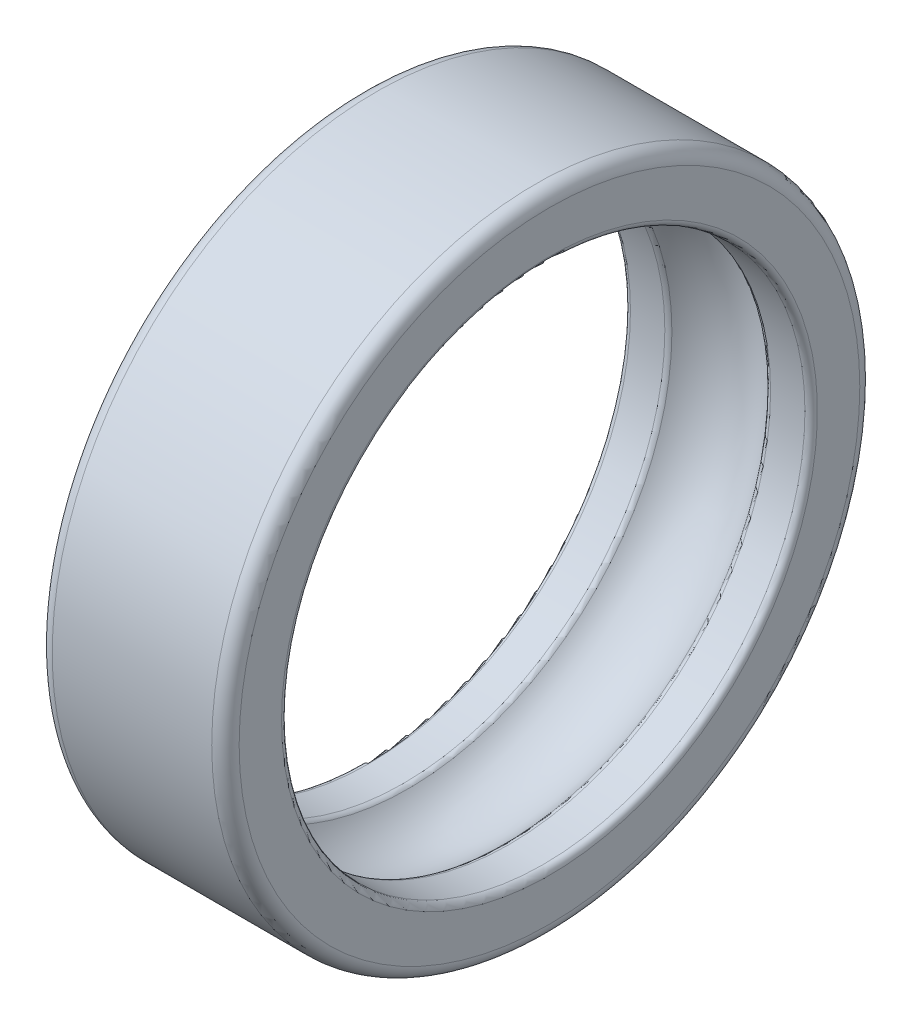
ISO-10303-21;
HEADER;
FILE_DESCRIPTION(('STEP AP214'),'2;1');
FILE_NAME('part.step','',(''),(''),'','','');
FILE_SCHEMA(('AUTOMOTIVE_DESIGN { 1 0 10303 214 1 1 1 1 }'));
ENDSEC;
DATA;
#1=APPLICATION_CONTEXT('core data for automotive mechanical design processes');
#2=APPLICATION_PROTOCOL_DEFINITION('international standard','automotive_design',2000,#1);
#3=PRODUCT_CONTEXT('',#1,'mechanical');
#4=PRODUCT('Part','Part','',(#3));
#5=PRODUCT_RELATED_PRODUCT_CATEGORY('part','',(#4));
#6=PRODUCT_DEFINITION_FORMATION('','',#4);
#7=PRODUCT_DEFINITION_CONTEXT('part definition',#1,'design');
#8=PRODUCT_DEFINITION('design','',#6,#7);
#9=PRODUCT_DEFINITION_SHAPE('','',#8);
#10=(LENGTH_UNIT() NAMED_UNIT(*) SI_UNIT(.MILLI.,.METRE.));
#11=(NAMED_UNIT(*) PLANE_ANGLE_UNIT() SI_UNIT($,.RADIAN.));
#12=(NAMED_UNIT(*) SI_UNIT($,.STERADIAN.) SOLID_ANGLE_UNIT());
#13=UNCERTAINTY_MEASURE_WITH_UNIT(LENGTH_MEASURE(1.E-05),#10,'distance_accuracy_value','');
#14=(GEOMETRIC_REPRESENTATION_CONTEXT(3) GLOBAL_UNCERTAINTY_ASSIGNED_CONTEXT((#13)) GLOBAL_UNIT_ASSIGNED_CONTEXT((#10,
#11,#12)) REPRESENTATION_CONTEXT('',''));
#15=CARTESIAN_POINT('',(0.,0.,0.));
#16=DIRECTION('',(0.,0.,1.));
#17=DIRECTION('',(1.,0.,0.));
#18=AXIS2_PLACEMENT_3D('',#15,#16,#17);
#19=CARTESIAN_POINT('',(12.9439252336449,0.,0.));
#20=DIRECTION('',(1.,0.,0.));
#21=DIRECTION('',(0.,0.,-1.));
#22=AXIS2_PLACEMENT_3D('',#19,#20,#21);
#23=CYLINDRICAL_SURFACE('',#22,21.);
#24=CARTESIAN_POINT('',(4.24264068711929,0.,0.));
#25=DIRECTION('',(-1.,0.,0.));
#26=DIRECTION('',(0.,0.,1.));
#27=AXIS2_PLACEMENT_3D('',#24,#25,#26);
#28=CIRCLE('',#27,21.);
#29=CARTESIAN_POINT('',(4.24264068711929,0.,21.));
#30=VERTEX_POINT('',#29);
#31=EDGE_CURVE('E50',#30,#30,#28,.T.);
#32=ORIENTED_EDGE('',*,*,#31,.T.);
#33=EDGE_LOOP('',(#32));
#34=FACE_BOUND('',#33,.T.);
#35=CARTESIAN_POINT('',(7.,0.,0.));
#36=DIRECTION('',(-1.,0.,0.));
#37=DIRECTION('',(0.,0.,1.));
#38=AXIS2_PLACEMENT_3D('',#35,#36,#37);
#39=CIRCLE('',#38,21.);
#40=CARTESIAN_POINT('',(7.,0.,21.));
#41=VERTEX_POINT('',#40);
#42=EDGE_CURVE('E54',#41,#41,#39,.F.);
#43=ORIENTED_EDGE('',*,*,#42,.T.);
#44=EDGE_LOOP('',(#43));
#45=FACE_BOUND('',#44,.T.);
#46=ADVANCED_FACE('F43',(#34,#45),#23,.F.);
#47=CARTESIAN_POINT('',(0.,0.,0.));
#48=DIRECTION('',(1.,0.,0.));
#49=DIRECTION('',(0.,0.,-1.));
#50=AXIS2_PLACEMENT_3D('',#47,#48,#49);
#51=TOROIDAL_SURFACE('',#50,18.,5.);
#52=CARTESIAN_POINT('',(-3.85694607919933,0.,0.));
#53=DIRECTION('',(1.,0.,0.));
#54=DIRECTION('',(0.,0.,-1.));
#55=AXIS2_PLACEMENT_3D('',#52,#53,#54);
#56=CIRCLE('',#55,21.1818181818182);
#57=CARTESIAN_POINT('',(-3.85694607919934,0.,-21.1818181818182));
#58=VERTEX_POINT('',#57);
#59=EDGE_CURVE('E58',#58,#58,#56,.F.);
#60=ORIENTED_EDGE('',*,*,#59,.T.);
#61=EDGE_LOOP('',(#60));
#62=FACE_BOUND('',#61,.T.);
#63=CARTESIAN_POINT('',(3.85694607919933,0.,0.));
#64=DIRECTION('',(-1.,0.,0.));
#65=DIRECTION('',(0.,0.,1.));
#66=AXIS2_PLACEMENT_3D('',#63,#64,#65);
#67=CIRCLE('',#66,21.1818181818182);
#68=CARTESIAN_POINT('',(3.85694607919933,0.,21.1818181818182));
#69=VERTEX_POINT('',#68);
#70=EDGE_CURVE('E63',#69,#69,#67,.F.);
#71=ORIENTED_EDGE('',*,*,#70,.T.);
#72=EDGE_LOOP('',(#71));
#73=FACE_BOUND('',#72,.T.);
#74=ADVANCED_FACE('F113',(#62,#73),#51,.F.);
#75=CARTESIAN_POINT('',(12.9439252336449,0.,0.));
#76=DIRECTION('',(1.,0.,0.));
#77=DIRECTION('',(0.,0.,-1.));
#78=AXIS2_PLACEMENT_3D('',#75,#76,#77);
#79=CYLINDRICAL_SURFACE('',#78,21.);
#80=CARTESIAN_POINT('',(-7.,0.,0.));
#81=DIRECTION('',(1.,0.,0.));
#82=DIRECTION('',(0.,0.,-1.));
#83=AXIS2_PLACEMENT_3D('',#80,#81,#82);
#84=CIRCLE('',#83,21.);
#85=CARTESIAN_POINT('',(-7.00000000000001,0.,-21.));
#86=VERTEX_POINT('',#85);
#87=EDGE_CURVE('E66',#86,#86,#84,.F.);
#88=ORIENTED_EDGE('',*,*,#87,.T.);
#89=EDGE_LOOP('',(#88));
#90=FACE_BOUND('',#89,.T.);
#91=CARTESIAN_POINT('',(-4.24264068711929,0.,0.));
#92=DIRECTION('',(-1.,0.,0.));
#93=DIRECTION('',(0.,0.,1.));
#94=AXIS2_PLACEMENT_3D('',#91,#92,#93);
#95=CIRCLE('',#94,21.);
#96=CARTESIAN_POINT('',(-4.24264068711929,0.,21.));
#97=VERTEX_POINT('',#96);
#98=EDGE_CURVE('E69',#97,#97,#95,.F.);
#99=ORIENTED_EDGE('',*,*,#98,.T.);
#100=EDGE_LOOP('',(#99));
#101=FACE_BOUND('',#100,.T.);
#102=ADVANCED_FACE('F118',(#90,#101),#79,.F.);
#103=CARTESIAN_POINT('',(-7.5,0.,26.));
#104=DIRECTION('',(1.,0.,0.));
#105=DIRECTION('',(0.,0.,-1.));
#106=AXIS2_PLACEMENT_3D('',#103,#104,#105);
#107=PLANE('',#106);
#108=CARTESIAN_POINT('',(-7.5,0.,0.));
#109=DIRECTION('',(1.,0.,0.));
#110=DIRECTION('',(0.,0.,-1.));
#111=AXIS2_PLACEMENT_3D('',#108,#109,#110);
#112=CIRCLE('',#111,21.5);
#113=CARTESIAN_POINT('',(-7.50000000000001,0.,-21.5));
#114=VERTEX_POINT('',#113);
#115=EDGE_CURVE('E72',#114,#114,#112,.T.);
#116=ORIENTED_EDGE('',*,*,#115,.T.);
#117=EDGE_LOOP('',(#116));
#118=FACE_BOUND('',#117,.T.);
#119=CARTESIAN_POINT('',(-7.5,0.,0.));
#120=DIRECTION('',(1.,0.,0.));
#121=DIRECTION('',(0.,0.,-1.));
#122=AXIS2_PLACEMENT_3D('',#119,#120,#121);
#123=CIRCLE('',#122,24.9);
#124=CARTESIAN_POINT('',(-7.50000000000001,0.,-24.9));
#125=VERTEX_POINT('',#124);
#126=EDGE_CURVE('E78',#125,#125,#123,.F.);
#127=ORIENTED_EDGE('',*,*,#126,.T.);
#128=EDGE_LOOP('',(#127));
#129=FACE_BOUND('',#128,.T.);
#130=ADVANCED_FACE('F109',(#118,#129),#107,.F.);
#131=CARTESIAN_POINT('',(12.9439252336449,0.,0.));
#132=DIRECTION('',(1.,0.,0.));
#133=DIRECTION('',(0.,0.,-1.));
#134=AXIS2_PLACEMENT_3D('',#131,#132,#133);
#135=CYLINDRICAL_SURFACE('',#134,26.);
#136=CARTESIAN_POINT('',(-6.4,0.,0.));
#137=DIRECTION('',(1.,0.,0.));
#138=DIRECTION('',(0.,0.,-1.));
#139=AXIS2_PLACEMENT_3D('',#136,#137,#138);
#140=CIRCLE('',#139,26.);
#141=CARTESIAN_POINT('',(-6.40000000000001,0.,-26.));
#142=VERTEX_POINT('',#141);
#143=EDGE_CURVE('E81',#142,#142,#140,.T.);
#144=ORIENTED_EDGE('',*,*,#143,.T.);
#145=EDGE_LOOP('',(#144));
#146=FACE_BOUND('',#145,.T.);
#147=CARTESIAN_POINT('',(6.4,0.,0.));
#148=DIRECTION('',(-1.,0.,0.));
#149=DIRECTION('',(0.,0.,1.));
#150=AXIS2_PLACEMENT_3D('',#147,#148,#149);
#151=CIRCLE('',#150,26.);
#152=CARTESIAN_POINT('',(6.4,0.,26.));
#153=VERTEX_POINT('',#152);
#154=EDGE_CURVE('E84',#153,#153,#151,.T.);
#155=ORIENTED_EDGE('',*,*,#154,.T.);
#156=EDGE_LOOP('',(#155));
#157=FACE_BOUND('',#156,.T.);
#158=ADVANCED_FACE('F88',(#146,#157),#135,.T.);
#159=CARTESIAN_POINT('',(7.5,0.,21.));
#160=DIRECTION('',(-1.,0.,0.));
#161=DIRECTION('',(0.,0.,1.));
#162=AXIS2_PLACEMENT_3D('',#159,#160,#161);
#163=PLANE('',#162);
#164=CARTESIAN_POINT('',(7.5,0.,0.));
#165=DIRECTION('',(-1.,0.,0.));
#166=DIRECTION('',(0.,0.,1.));
#167=AXIS2_PLACEMENT_3D('',#164,#165,#166);
#168=CIRCLE('',#167,21.5);
#169=CARTESIAN_POINT('',(7.5,0.,21.5));
#170=VERTEX_POINT('',#169);
#171=EDGE_CURVE('E10',#170,#170,#168,.T.);
#172=ORIENTED_EDGE('',*,*,#171,.T.);
#173=EDGE_LOOP('',(#172));
#174=FACE_BOUND('',#173,.T.);
#175=CARTESIAN_POINT('',(7.5,0.,0.));
#176=DIRECTION('',(-1.,0.,0.));
#177=DIRECTION('',(0.,0.,1.));
#178=AXIS2_PLACEMENT_3D('',#175,#176,#177);
#179=CIRCLE('',#178,24.9);
#180=CARTESIAN_POINT('',(7.5,0.,24.9));
#181=VERTEX_POINT('',#180);
#182=EDGE_CURVE('E75',#181,#181,#179,.F.);
#183=ORIENTED_EDGE('',*,*,#182,.T.);
#184=EDGE_LOOP('',(#183));
#185=FACE_BOUND('',#184,.T.);
#186=ADVANCED_FACE('F98',(#174,#185),#163,.F.);
#187=CARTESIAN_POINT('',(-6.4,0.,0.));
#188=DIRECTION('',(1.,0.,0.));
#189=DIRECTION('',(0.,0.,-1.));
#190=AXIS2_PLACEMENT_3D('',#187,#188,#189);
#191=TOROIDAL_SURFACE('',#190,24.9,1.1);
#192=ORIENTED_EDGE('',*,*,#126,.F.);
#193=EDGE_LOOP('',(#192));
#194=FACE_BOUND('',#193,.T.);
#195=ORIENTED_EDGE('',*,*,#143,.F.);
#196=EDGE_LOOP('',(#195));
#197=FACE_BOUND('',#196,.T.);
#198=ADVANCED_FACE('F94',(#194,#197),#191,.T.);
#199=CARTESIAN_POINT('',(6.4,0.,0.));
#200=DIRECTION('',(-1.,0.,0.));
#201=DIRECTION('',(0.,0.,1.));
#202=AXIS2_PLACEMENT_3D('',#199,#200,#201);
#203=TOROIDAL_SURFACE('',#202,24.9,1.1);
#204=ORIENTED_EDGE('',*,*,#154,.F.);
#205=EDGE_LOOP('',(#204));
#206=FACE_BOUND('',#205,.T.);
#207=ORIENTED_EDGE('',*,*,#182,.F.);
#208=EDGE_LOOP('',(#207));
#209=FACE_BOUND('',#208,.T.);
#210=ADVANCED_FACE('F90',(#206,#209),#203,.T.);
#211=CARTESIAN_POINT('',(-7.,0.,0.));
#212=DIRECTION('',(1.,0.,0.));
#213=DIRECTION('',(0.,0.,-1.));
#214=AXIS2_PLACEMENT_3D('',#211,#212,#213);
#215=TOROIDAL_SURFACE('',#214,21.5,0.5);
#216=ORIENTED_EDGE('',*,*,#87,.F.);
#217=EDGE_LOOP('',(#216));
#218=FACE_BOUND('',#217,.T.);
#219=ORIENTED_EDGE('',*,*,#115,.F.);
#220=EDGE_LOOP('',(#219));
#221=FACE_BOUND('',#220,.T.);
#222=ADVANCED_FACE('F93',(#218,#221),#215,.T.);
#223=CARTESIAN_POINT('',(-4.24264068711929,0.,0.));
#224=DIRECTION('',(-1.,0.,0.));
#225=DIRECTION('',(0.,0.,1.));
#226=AXIS2_PLACEMENT_3D('',#223,#224,#225);
#227=TOROIDAL_SURFACE('',#226,21.5,0.5);
#228=ORIENTED_EDGE('',*,*,#59,.F.);
#229=EDGE_LOOP('',(#228));
#230=FACE_BOUND('',#229,.T.);
#231=ORIENTED_EDGE('',*,*,#98,.F.);
#232=EDGE_LOOP('',(#231));
#233=FACE_BOUND('',#232,.T.);
#234=ADVANCED_FACE('F125',(#230,#233),#227,.T.);
#235=CARTESIAN_POINT('',(4.24264068711929,0.,0.));
#236=DIRECTION('',(-1.,0.,0.));
#237=DIRECTION('',(0.,0.,1.));
#238=AXIS2_PLACEMENT_3D('',#235,#236,#237);
#239=TOROIDAL_SURFACE('',#238,21.5,0.5);
#240=ORIENTED_EDGE('',*,*,#31,.F.);
#241=EDGE_LOOP('',(#240));
#242=FACE_BOUND('',#241,.T.);
#243=ORIENTED_EDGE('',*,*,#70,.F.);
#244=EDGE_LOOP('',(#243));
#245=FACE_BOUND('',#244,.T.);
#246=ADVANCED_FACE('F128',(#242,#245),#239,.T.);
#247=CARTESIAN_POINT('',(7.,0.,0.));
#248=DIRECTION('',(-1.,0.,0.));
#249=DIRECTION('',(0.,0.,1.));
#250=AXIS2_PLACEMENT_3D('',#247,#248,#249);
#251=TOROIDAL_SURFACE('',#250,21.5,0.5);
#252=ORIENTED_EDGE('',*,*,#171,.F.);
#253=EDGE_LOOP('',(#252));
#254=FACE_BOUND('',#253,.T.);
#255=ORIENTED_EDGE('',*,*,#42,.F.);
#256=EDGE_LOOP('',(#255));
#257=FACE_BOUND('',#256,.T.);
#258=ADVANCED_FACE('F45',(#254,#257),#251,.T.);
#259=CLOSED_SHELL('',(#46,#74,#102,#130,#158,#186,#198,#210,#222,#234,#246,#258));
#260=MANIFOLD_SOLID_BREP('B2',#259);
#261=ADVANCED_BREP_SHAPE_REPRESENTATION('',(#18,#260),#14);
#262=SHAPE_DEFINITION_REPRESENTATION(#9,#261);
ENDSEC;
END-ISO-10303-21;
